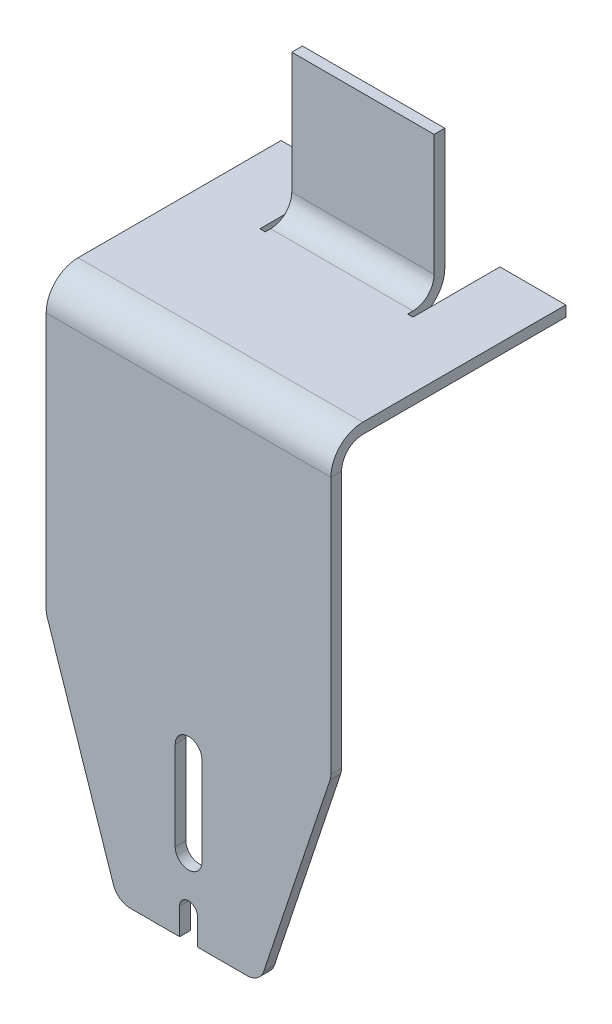
ISO-10303-21;
HEADER;
FILE_DESCRIPTION(('STEP AP214'),'2;1');
FILE_NAME('part.step','',(''),(''),'','','');
FILE_SCHEMA(('AUTOMOTIVE_DESIGN { 1 0 10303 214 1 1 1 1 }'));
ENDSEC;
DATA;
#1=APPLICATION_CONTEXT('core data for automotive mechanical design processes');
#2=APPLICATION_PROTOCOL_DEFINITION('international standard','automotive_design',2000,#1);
#3=PRODUCT_CONTEXT('',#1,'mechanical');
#4=PRODUCT('Part','Part','',(#3));
#5=PRODUCT_RELATED_PRODUCT_CATEGORY('part','',(#4));
#6=PRODUCT_DEFINITION_FORMATION('','',#4);
#7=PRODUCT_DEFINITION_CONTEXT('part definition',#1,'design');
#8=PRODUCT_DEFINITION('design','',#6,#7);
#9=PRODUCT_DEFINITION_SHAPE('','',#8);
#10=(LENGTH_UNIT() NAMED_UNIT(*) SI_UNIT(.MILLI.,.METRE.));
#11=(NAMED_UNIT(*) PLANE_ANGLE_UNIT() SI_UNIT($,.RADIAN.));
#12=(NAMED_UNIT(*) SI_UNIT($,.STERADIAN.) SOLID_ANGLE_UNIT());
#13=UNCERTAINTY_MEASURE_WITH_UNIT(LENGTH_MEASURE(1.E-05),#10,'distance_accuracy_value','');
#14=(GEOMETRIC_REPRESENTATION_CONTEXT(3) GLOBAL_UNCERTAINTY_ASSIGNED_CONTEXT((#13)) GLOBAL_UNIT_ASSIGNED_CONTEXT((#10,
#11,#12)) REPRESENTATION_CONTEXT('',''));
#15=CARTESIAN_POINT('',(0.,0.,0.));
#16=DIRECTION('',(0.,0.,1.));
#17=DIRECTION('',(1.,0.,0.));
#18=AXIS2_PLACEMENT_3D('',#15,#16,#17);
#19=CARTESIAN_POINT('',(0.,-2.89985202796982E-13,-83.09));
#20=DIRECTION('',(0.,0.,1.));
#21=DIRECTION('',(0.,-1.,0.));
#22=AXIS2_PLACEMENT_3D('',#19,#20,#21);
#23=PLANE('',#22);
#24=DIRECTION('',(0.,-1.,0.));
#25=VECTOR('',#24,1.);
#26=CARTESIAN_POINT('',(120.,11.9099999999998,-83.09));
#27=LINE('',#26,#25);
#28=CARTESIAN_POINT('',(120.,17.9099999999998,-83.09));
#29=VERTEX_POINT('',#28);
#30=CARTESIAN_POINT('',(120.,11.9099999999998,-83.09));
#31=VERTEX_POINT('',#30);
#32=EDGE_CURVE('E326',#29,#31,#27,.T.);
#33=ORIENTED_EDGE('',*,*,#32,.F.);
#34=DIRECTION('',(1.,0.,0.));
#35=VECTOR('',#34,1.);
#36=CARTESIAN_POINT('',(160.,17.9099999999998,-83.0900000000001));
#37=LINE('',#36,#35);
#38=CARTESIAN_POINT('',(123.,17.9099999999998,-83.09));
#39=VERTEX_POINT('',#38);
#40=EDGE_CURVE('E407',#29,#39,#37,.T.);
#41=ORIENTED_EDGE('',*,*,#40,.T.);
#42=DIRECTION('',(0.,1.,0.));
#43=VECTOR('',#42,1.);
#44=CARTESIAN_POINT('',(123.,11.9099999999998,-83.09));
#45=LINE('',#44,#43);
#46=CARTESIAN_POINT('',(123.,11.9099999999998,-83.09));
#47=VERTEX_POINT('',#46);
#48=EDGE_CURVE('E365',#47,#39,#45,.T.);
#49=ORIENTED_EDGE('',*,*,#48,.F.);
#50=DIRECTION('',(-1.,0.,0.));
#51=VECTOR('',#50,1.);
#52=CARTESIAN_POINT('',(160.,11.9099999999998,-83.09));
#53=LINE('',#52,#51);
#54=EDGE_CURVE('E72',#47,#31,#53,.T.);
#55=ORIENTED_EDGE('',*,*,#54,.T.);
#56=EDGE_LOOP('',(#33,#41,#49,#55));
#57=FACE_BOUND('',#56,.T.);
#58=ADVANCED_FACE('F46',(#57),#23,.F.);
#59=DIRECTION('',(0.,1.,0.));
#60=VECTOR('',#59,1.);
#61=CARTESIAN_POINT('',(40.,11.9099999999998,-83.09));
#62=LINE('',#61,#60);
#63=CARTESIAN_POINT('',(40.,11.9099999999998,-83.09));
#64=VERTEX_POINT('',#63);
#65=CARTESIAN_POINT('',(40.,17.9099999999998,-83.0900000000001));
#66=VERTEX_POINT('',#65);
#67=EDGE_CURVE('E64',#64,#66,#62,.T.);
#68=ORIENTED_EDGE('',*,*,#67,.F.);
#69=CARTESIAN_POINT('',(37.,11.9099999999998,-83.09));
#70=VERTEX_POINT('',#69);
#71=EDGE_CURVE('E404',#64,#70,#53,.T.);
#72=ORIENTED_EDGE('',*,*,#71,.T.);
#73=DIRECTION('',(0.,-1.,0.));
#74=VECTOR('',#73,1.);
#75=CARTESIAN_POINT('',(37.,11.9099999999998,-83.09));
#76=LINE('',#75,#74);
#77=CARTESIAN_POINT('',(37.,17.9099999999998,-83.09));
#78=VERTEX_POINT('',#77);
#79=EDGE_CURVE('E361',#78,#70,#76,.T.);
#80=ORIENTED_EDGE('',*,*,#79,.F.);
#81=EDGE_CURVE('E408',#78,#66,#37,.T.);
#82=ORIENTED_EDGE('',*,*,#81,.T.);
#83=EDGE_LOOP('',(#68,#72,#80,#82));
#84=FACE_BOUND('',#83,.T.);
#85=ADVANCED_FACE('F709',(#84),#23,.F.);
#86=CARTESIAN_POINT('',(0.,-144.47,-6.));
#87=DIRECTION('',(-1.,0.,0.));
#88=DIRECTION('',(0.,-1.,0.));
#89=AXIS2_PLACEMENT_3D('',#86,#87,#88);
#90=PLANE('',#89);
#91=DIRECTION('',(0.,-1.,0.));
#92=VECTOR('',#91,1.);
#93=CARTESIAN_POINT('',(0.,-144.47,0.));
#94=LINE('',#93,#92);
#95=CARTESIAN_POINT('',(0.,0.,0.));
#96=VERTEX_POINT('',#95);
#97=CARTESIAN_POINT('',(0.,-144.47,0.));
#98=VERTEX_POINT('',#97);
#99=EDGE_CURVE('E484',#96,#98,#94,.T.);
#100=ORIENTED_EDGE('',*,*,#99,.F.);
#101=DIRECTION('',(0.,0.,1.));
#102=VECTOR('',#101,1.);
#103=CARTESIAN_POINT('',(0.,0.,-6.));
#104=LINE('',#103,#102);
#105=CARTESIAN_POINT('',(0.,0.,-6.));
#106=VERTEX_POINT('',#105);
#107=EDGE_CURVE('E11',#106,#96,#104,.T.);
#108=ORIENTED_EDGE('',*,*,#107,.F.);
#109=DIRECTION('',(0.,-1.,0.));
#110=VECTOR('',#109,1.);
#111=CARTESIAN_POINT('',(0.,-144.47,-6.));
#112=LINE('',#111,#110);
#113=CARTESIAN_POINT('',(0.,-144.47,-6.));
#114=VERTEX_POINT('',#113);
#115=EDGE_CURVE('E494',#106,#114,#112,.T.);
#116=ORIENTED_EDGE('',*,*,#115,.T.);
#117=DIRECTION('',(0.,0.,1.));
#118=VECTOR('',#117,1.);
#119=CARTESIAN_POINT('',(0.,-144.47,-6.));
#120=LINE('',#119,#118);
#121=EDGE_CURVE('E50',#114,#98,#120,.T.);
#122=ORIENTED_EDGE('',*,*,#121,.T.);
#123=EDGE_LOOP('',(#100,#108,#116,#122));
#124=FACE_BOUND('',#123,.T.);
#125=ADVANCED_FACE('F48',(#124),#90,.T.);
#126=CARTESIAN_POINT('',(160.,0.,-6.));
#127=DIRECTION('',(1.,0.,0.));
#128=DIRECTION('',(0.,1.,0.));
#129=AXIS2_PLACEMENT_3D('',#126,#127,#128);
#130=PLANE('',#129);
#131=DIRECTION('',(0.,1.,0.));
#132=VECTOR('',#131,1.);
#133=CARTESIAN_POINT('',(160.,0.,0.));
#134=LINE('',#133,#132);
#135=CARTESIAN_POINT('',(160.,-144.47,0.));
#136=VERTEX_POINT('',#135);
#137=CARTESIAN_POINT('',(160.,0.,0.));
#138=VERTEX_POINT('',#137);
#139=EDGE_CURVE('E597',#136,#138,#134,.T.);
#140=ORIENTED_EDGE('',*,*,#139,.F.);
#141=DIRECTION('',(0.,0.,1.));
#142=VECTOR('',#141,1.);
#143=CARTESIAN_POINT('',(160.,-144.47,-6.));
#144=LINE('',#143,#142);
#145=CARTESIAN_POINT('',(160.,-144.47,-6.));
#146=VERTEX_POINT('',#145);
#147=EDGE_CURVE('E605',#146,#136,#144,.T.);
#148=ORIENTED_EDGE('',*,*,#147,.F.);
#149=DIRECTION('',(0.,1.,0.));
#150=VECTOR('',#149,1.);
#151=CARTESIAN_POINT('',(160.,0.,-6.));
#152=LINE('',#151,#150);
#153=CARTESIAN_POINT('',(160.,0.,-6.));
#154=VERTEX_POINT('',#153);
#155=EDGE_CURVE('E543',#146,#154,#152,.T.);
#156=ORIENTED_EDGE('',*,*,#155,.T.);
#157=DIRECTION('',(0.,0.,1.));
#158=VECTOR('',#157,1.);
#159=CARTESIAN_POINT('',(160.,0.,-6.));
#160=LINE('',#159,#158);
#161=EDGE_CURVE('E56',#154,#138,#160,.T.);
#162=ORIENTED_EDGE('',*,*,#161,.T.);
#163=EDGE_LOOP('',(#140,#148,#156,#162));
#164=FACE_BOUND('',#163,.T.);
#165=ADVANCED_FACE('F756',(#164),#130,.T.);
#166=CARTESIAN_POINT('',(150.,-144.47,-6.));
#167=DIRECTION('',(0.,0.,1.));
#168=DIRECTION('',(1.,0.,0.));
#169=AXIS2_PLACEMENT_3D('',#166,#167,#168);
#170=CYLINDRICAL_SURFACE('',#169,10.);
#171=CARTESIAN_POINT('',(150.,-144.47,0.));
#172=DIRECTION('',(0.,0.,1.));
#173=DIRECTION('',(1.,0.,0.));
#174=AXIS2_PLACEMENT_3D('',#171,#172,#173);
#175=CIRCLE('',#174,10.);
#176=CARTESIAN_POINT('',(159.486747985608,-147.632532633439,0.));
#177=VERTEX_POINT('',#176);
#178=EDGE_CURVE('E593',#177,#136,#175,.T.);
#179=ORIENTED_EDGE('',*,*,#178,.F.);
#180=DIRECTION('',(0.,0.,1.));
#181=VECTOR('',#180,1.);
#182=CARTESIAN_POINT('',(159.486747985608,-147.632532633439,-6.));
#183=LINE('',#182,#181);
#184=CARTESIAN_POINT('',(159.486747985608,-147.632532633439,-6.));
#185=VERTEX_POINT('',#184);
#186=EDGE_CURVE('E608',#185,#177,#183,.T.);
#187=ORIENTED_EDGE('',*,*,#186,.F.);
#188=CARTESIAN_POINT('',(150.,-144.47,-6.));
#189=DIRECTION('',(0.,0.,1.));
#190=DIRECTION('',(1.,0.,0.));
#191=AXIS2_PLACEMENT_3D('',#188,#189,#190);
#192=CIRCLE('',#191,10.);
#193=EDGE_CURVE('E539',#185,#146,#192,.T.);
#194=ORIENTED_EDGE('',*,*,#193,.T.);
#195=ORIENTED_EDGE('',*,*,#147,.T.);
#196=EDGE_LOOP('',(#179,#187,#194,#195));
#197=FACE_BOUND('',#196,.T.);
#198=ADVANCED_FACE('F759',(#197),#170,.T.);
#199=CARTESIAN_POINT('',(159.486747985608,-147.632532633439,-6.));
#200=DIRECTION('',(0.948674798560777,-0.316253263343904,0.));
#201=DIRECTION('',(0.316253263343904,0.948674798560777,0.));
#202=AXIS2_PLACEMENT_3D('',#199,#200,#201);
#203=PLANE('',#202);
#204=DIRECTION('',(0.316253263343904,0.948674798560777,0.));
#205=VECTOR('',#204,1.);
#206=CARTESIAN_POINT('',(159.486747985608,-147.632532633439,0.));
#207=LINE('',#206,#205);
#208=CARTESIAN_POINT('',(122.276747985608,-259.252532633439,0.));
#209=VERTEX_POINT('',#208);
#210=EDGE_CURVE('E589',#209,#177,#207,.T.);
#211=ORIENTED_EDGE('',*,*,#210,.F.);
#212=DIRECTION('',(0.,0.,1.));
#213=VECTOR('',#212,1.);
#214=CARTESIAN_POINT('',(122.276747985608,-259.252532633439,-6.));
#215=LINE('',#214,#213);
#216=CARTESIAN_POINT('',(122.276747985608,-259.252532633439,-6.));
#217=VERTEX_POINT('',#216);
#218=EDGE_CURVE('E611',#217,#209,#215,.T.);
#219=ORIENTED_EDGE('',*,*,#218,.F.);
#220=DIRECTION('',(0.316253263343904,0.948674798560777,0.));
#221=VECTOR('',#220,1.);
#222=CARTESIAN_POINT('',(159.486747985608,-147.632532633439,-6.));
#223=LINE('',#222,#221);
#224=EDGE_CURVE('E535',#217,#185,#223,.T.);
#225=ORIENTED_EDGE('',*,*,#224,.T.);
#226=ORIENTED_EDGE('',*,*,#186,.T.);
#227=EDGE_LOOP('',(#211,#219,#225,#226));
#228=FACE_BOUND('',#227,.T.);
#229=ADVANCED_FACE('F763',(#228),#203,.T.);
#230=CARTESIAN_POINT('',(112.79,-256.09,-6.));
#231=DIRECTION('',(0.,0.,1.));
#232=DIRECTION('',(1.,0.,0.));
#233=AXIS2_PLACEMENT_3D('',#230,#231,#232);
#234=CYLINDRICAL_SURFACE('',#233,9.99999999999998);
#235=CARTESIAN_POINT('',(112.79,-256.09,0.));
#236=DIRECTION('',(0.,0.,1.));
#237=DIRECTION('',(-1.,0.,0.));
#238=AXIS2_PLACEMENT_3D('',#235,#236,#237);
#239=CIRCLE('',#238,9.99999999999998);
#240=CARTESIAN_POINT('',(112.79,-266.09,0.));
#241=VERTEX_POINT('',#240);
#242=EDGE_CURVE('E585',#241,#209,#239,.T.);
#243=ORIENTED_EDGE('',*,*,#242,.F.);
#244=DIRECTION('',(0.,0.,1.));
#245=VECTOR('',#244,1.);
#246=CARTESIAN_POINT('',(112.79,-266.09,-6.));
#247=LINE('',#246,#245);
#248=CARTESIAN_POINT('',(112.79,-266.09,-6.));
#249=VERTEX_POINT('',#248);
#250=EDGE_CURVE('E614',#249,#241,#247,.T.);
#251=ORIENTED_EDGE('',*,*,#250,.F.);
#252=CARTESIAN_POINT('',(112.79,-256.09,-6.));
#253=DIRECTION('',(0.,0.,1.));
#254=DIRECTION('',(-1.,0.,0.));
#255=AXIS2_PLACEMENT_3D('',#252,#253,#254);
#256=CIRCLE('',#255,9.99999999999998);
#257=EDGE_CURVE('E531',#249,#217,#256,.T.);
#258=ORIENTED_EDGE('',*,*,#257,.T.);
#259=ORIENTED_EDGE('',*,*,#218,.T.);
#260=EDGE_LOOP('',(#243,#251,#258,#259));
#261=FACE_BOUND('',#260,.T.);
#262=ADVANCED_FACE('F767',(#261),#234,.T.);
#263=CARTESIAN_POINT('',(112.79,-266.09,-6.));
#264=DIRECTION('',(0.,-1.,0.));
#265=DIRECTION('',(0.,0.,-1.));
#266=AXIS2_PLACEMENT_3D('',#263,#264,#265);
#267=PLANE('',#266);
#268=DIRECTION('',(1.,0.,0.));
#269=VECTOR('',#268,1.);
#270=CARTESIAN_POINT('',(112.79,-266.09,0.));
#271=LINE('',#270,#269);
#272=CARTESIAN_POINT('',(85.,-266.09,0.));
#273=VERTEX_POINT('',#272);
#274=EDGE_CURVE('E581',#273,#241,#271,.T.);
#275=ORIENTED_EDGE('',*,*,#274,.F.);
#276=DIRECTION('',(0.,0.,1.));
#277=VECTOR('',#276,1.);
#278=CARTESIAN_POINT('',(85.,-266.09,-6.));
#279=LINE('',#278,#277);
#280=CARTESIAN_POINT('',(85.,-266.09,-6.));
#281=VERTEX_POINT('',#280);
#282=EDGE_CURVE('E617',#281,#273,#279,.T.);
#283=ORIENTED_EDGE('',*,*,#282,.F.);
#284=DIRECTION('',(1.,0.,0.));
#285=VECTOR('',#284,1.);
#286=CARTESIAN_POINT('',(112.79,-266.09,-6.));
#287=LINE('',#286,#285);
#288=EDGE_CURVE('E527',#281,#249,#287,.T.);
#289=ORIENTED_EDGE('',*,*,#288,.T.);
#290=ORIENTED_EDGE('',*,*,#250,.T.);
#291=EDGE_LOOP('',(#275,#283,#289,#290));
#292=FACE_BOUND('',#291,.T.);
#293=ADVANCED_FACE('F771',(#292),#267,.T.);
#294=CARTESIAN_POINT('',(85.,-266.09,-6.));
#295=DIRECTION('',(-1.,0.,0.));
#296=DIRECTION('',(0.,-1.,0.));
#297=AXIS2_PLACEMENT_3D('',#294,#295,#296);
#298=PLANE('',#297);
#299=DIRECTION('',(0.,-1.,0.));
#300=VECTOR('',#299,1.);
#301=CARTESIAN_POINT('',(85.,-266.09,0.));
#302=LINE('',#301,#300);
#303=CARTESIAN_POINT('',(85.,-251.09,0.));
#304=VERTEX_POINT('',#303);
#305=EDGE_CURVE('E577',#304,#273,#302,.T.);
#306=ORIENTED_EDGE('',*,*,#305,.F.);
#307=DIRECTION('',(0.,0.,1.));
#308=VECTOR('',#307,1.);
#309=CARTESIAN_POINT('',(85.,-251.09,-6.));
#310=LINE('',#309,#308);
#311=CARTESIAN_POINT('',(85.,-251.09,-6.));
#312=VERTEX_POINT('',#311);
#313=EDGE_CURVE('E620',#312,#304,#310,.T.);
#314=ORIENTED_EDGE('',*,*,#313,.F.);
#315=DIRECTION('',(0.,-1.,0.));
#316=VECTOR('',#315,1.);
#317=CARTESIAN_POINT('',(85.,-266.09,-6.));
#318=LINE('',#317,#316);
#319=EDGE_CURVE('E523',#312,#281,#318,.T.);
#320=ORIENTED_EDGE('',*,*,#319,.T.);
#321=ORIENTED_EDGE('',*,*,#282,.T.);
#322=EDGE_LOOP('',(#306,#314,#320,#321));
#323=FACE_BOUND('',#322,.T.);
#324=ADVANCED_FACE('F775',(#323),#298,.T.);
#325=CARTESIAN_POINT('',(80.,-251.09,-6.));
#326=DIRECTION('',(0.,0.,1.));
#327=DIRECTION('',(1.,0.,0.));
#328=AXIS2_PLACEMENT_3D('',#325,#326,#327);
#329=CYLINDRICAL_SURFACE('',#328,4.99999999999999);
#330=CARTESIAN_POINT('',(80.,-251.09,0.));
#331=DIRECTION('',(0.,0.,-1.));
#332=DIRECTION('',(1.,0.,0.));
#333=AXIS2_PLACEMENT_3D('',#330,#331,#332);
#334=CIRCLE('',#333,4.99999999999999);
#335=CARTESIAN_POINT('',(75.,-251.09,0.));
#336=VERTEX_POINT('',#335);
#337=EDGE_CURVE('E573',#336,#304,#334,.T.);
#338=ORIENTED_EDGE('',*,*,#337,.F.);
#339=DIRECTION('',(0.,0.,1.));
#340=VECTOR('',#339,1.);
#341=CARTESIAN_POINT('',(75.,-251.09,-6.));
#342=LINE('',#341,#340);
#343=CARTESIAN_POINT('',(75.,-251.09,-6.));
#344=VERTEX_POINT('',#343);
#345=EDGE_CURVE('E623',#344,#336,#342,.T.);
#346=ORIENTED_EDGE('',*,*,#345,.F.);
#347=CARTESIAN_POINT('',(80.,-251.09,-6.));
#348=DIRECTION('',(0.,0.,-1.));
#349=DIRECTION('',(1.,0.,0.));
#350=AXIS2_PLACEMENT_3D('',#347,#348,#349);
#351=CIRCLE('',#350,4.99999999999999);
#352=EDGE_CURVE('E519',#344,#312,#351,.T.);
#353=ORIENTED_EDGE('',*,*,#352,.T.);
#354=ORIENTED_EDGE('',*,*,#313,.T.);
#355=EDGE_LOOP('',(#338,#346,#353,#354));
#356=FACE_BOUND('',#355,.T.);
#357=ADVANCED_FACE('F779',(#356),#329,.F.);
#358=CARTESIAN_POINT('',(75.,-251.09,-6.));
#359=DIRECTION('',(1.,0.,0.));
#360=DIRECTION('',(0.,0.,-1.));
#361=AXIS2_PLACEMENT_3D('',#358,#359,#360);
#362=PLANE('',#361);
#363=DIRECTION('',(0.,1.,0.));
#364=VECTOR('',#363,1.);
#365=CARTESIAN_POINT('',(75.,-251.09,0.));
#366=LINE('',#365,#364);
#367=CARTESIAN_POINT('',(75.,-266.09,0.));
#368=VERTEX_POINT('',#367);
#369=EDGE_CURVE('E569',#368,#336,#366,.T.);
#370=ORIENTED_EDGE('',*,*,#369,.F.);
#371=DIRECTION('',(0.,0.,1.));
#372=VECTOR('',#371,1.);
#373=CARTESIAN_POINT('',(75.,-266.09,-6.));
#374=LINE('',#373,#372);
#375=CARTESIAN_POINT('',(75.,-266.09,-6.));
#376=VERTEX_POINT('',#375);
#377=EDGE_CURVE('E626',#376,#368,#374,.T.);
#378=ORIENTED_EDGE('',*,*,#377,.F.);
#379=DIRECTION('',(0.,1.,0.));
#380=VECTOR('',#379,1.);
#381=CARTESIAN_POINT('',(75.,-251.09,-6.));
#382=LINE('',#381,#380);
#383=EDGE_CURVE('E515',#376,#344,#382,.T.);
#384=ORIENTED_EDGE('',*,*,#383,.T.);
#385=ORIENTED_EDGE('',*,*,#345,.T.);
#386=EDGE_LOOP('',(#370,#378,#384,#385));
#387=FACE_BOUND('',#386,.T.);
#388=ADVANCED_FACE('F783',(#387),#362,.T.);
#389=CARTESIAN_POINT('',(75.,-266.09,-6.));
#390=DIRECTION('',(0.,-1.,0.));
#391=DIRECTION('',(0.,0.,-1.));
#392=AXIS2_PLACEMENT_3D('',#389,#390,#391);
#393=PLANE('',#392);
#394=DIRECTION('',(1.,0.,0.));
#395=VECTOR('',#394,1.);
#396=CARTESIAN_POINT('',(75.,-266.09,0.));
#397=LINE('',#396,#395);
#398=CARTESIAN_POINT('',(47.21,-266.09,0.));
#399=VERTEX_POINT('',#398);
#400=EDGE_CURVE('E565',#399,#368,#397,.T.);
#401=ORIENTED_EDGE('',*,*,#400,.F.);
#402=DIRECTION('',(0.,0.,1.));
#403=VECTOR('',#402,1.);
#404=CARTESIAN_POINT('',(47.21,-266.09,-6.));
#405=LINE('',#404,#403);
#406=CARTESIAN_POINT('',(47.21,-266.09,-6.));
#407=VERTEX_POINT('',#406);
#408=EDGE_CURVE('E629',#407,#399,#405,.T.);
#409=ORIENTED_EDGE('',*,*,#408,.F.);
#410=DIRECTION('',(1.,0.,0.));
#411=VECTOR('',#410,1.);
#412=CARTESIAN_POINT('',(75.,-266.09,-6.));
#413=LINE('',#412,#411);
#414=EDGE_CURVE('E511',#407,#376,#413,.T.);
#415=ORIENTED_EDGE('',*,*,#414,.T.);
#416=ORIENTED_EDGE('',*,*,#377,.T.);
#417=EDGE_LOOP('',(#401,#409,#415,#416));
#418=FACE_BOUND('',#417,.T.);
#419=ADVANCED_FACE('F787',(#418),#393,.T.);
#420=CARTESIAN_POINT('',(47.21,-256.09,-6.));
#421=DIRECTION('',(0.,0.,1.));
#422=DIRECTION('',(1.,0.,0.));
#423=AXIS2_PLACEMENT_3D('',#420,#421,#422);
#424=CYLINDRICAL_SURFACE('',#423,10.);
#425=CARTESIAN_POINT('',(47.21,-256.09,0.));
#426=DIRECTION('',(0.,0.,1.));
#427=DIRECTION('',(-1.,0.,0.));
#428=AXIS2_PLACEMENT_3D('',#425,#426,#427);
#429=CIRCLE('',#428,10.);
#430=CARTESIAN_POINT('',(37.7232520143922,-259.252532633439,0.));
#431=VERTEX_POINT('',#430);
#432=EDGE_CURVE('E561',#431,#399,#429,.T.);
#433=ORIENTED_EDGE('',*,*,#432,.F.);
#434=DIRECTION('',(0.,0.,1.));
#435=VECTOR('',#434,1.);
#436=CARTESIAN_POINT('',(37.7232520143922,-259.252532633439,-6.));
#437=LINE('',#436,#435);
#438=CARTESIAN_POINT('',(37.7232520143922,-259.252532633439,-6.));
#439=VERTEX_POINT('',#438);
#440=EDGE_CURVE('E632',#439,#431,#437,.T.);
#441=ORIENTED_EDGE('',*,*,#440,.F.);
#442=CARTESIAN_POINT('',(47.21,-256.09,-6.));
#443=DIRECTION('',(0.,0.,1.));
#444=DIRECTION('',(-1.,0.,0.));
#445=AXIS2_PLACEMENT_3D('',#442,#443,#444);
#446=CIRCLE('',#445,10.);
#447=EDGE_CURVE('E507',#439,#407,#446,.T.);
#448=ORIENTED_EDGE('',*,*,#447,.T.);
#449=ORIENTED_EDGE('',*,*,#408,.T.);
#450=EDGE_LOOP('',(#433,#441,#448,#449));
#451=FACE_BOUND('',#450,.T.);
#452=ADVANCED_FACE('F791',(#451),#424,.T.);
#453=CARTESIAN_POINT('',(37.7232520143923,-259.252532633439,-6.));
#454=DIRECTION('',(-0.948674798560777,-0.316253263343904,0.));
#455=DIRECTION('',(0.316253263343904,-0.948674798560777,0.));
#456=AXIS2_PLACEMENT_3D('',#453,#454,#455);
#457=PLANE('',#456);
#458=DIRECTION('',(0.316253263343904,-0.948674798560777,0.));
#459=VECTOR('',#458,1.);
#460=CARTESIAN_POINT('',(37.7232520143923,-259.252532633439,0.));
#461=LINE('',#460,#459);
#462=CARTESIAN_POINT('',(0.513252014392235,-147.632532633439,0.));
#463=VERTEX_POINT('',#462);
#464=EDGE_CURVE('E557',#463,#431,#461,.T.);
#465=ORIENTED_EDGE('',*,*,#464,.F.);
#466=DIRECTION('',(0.,0.,1.));
#467=VECTOR('',#466,1.);
#468=CARTESIAN_POINT('',(0.513252014392235,-147.632532633439,-6.));
#469=LINE('',#468,#467);
#470=CARTESIAN_POINT('',(0.513252014392235,-147.632532633439,-6.));
#471=VERTEX_POINT('',#470);
#472=EDGE_CURVE('E634',#471,#463,#469,.T.);
#473=ORIENTED_EDGE('',*,*,#472,.F.);
#474=DIRECTION('',(0.316253263343904,-0.948674798560777,0.));
#475=VECTOR('',#474,1.);
#476=CARTESIAN_POINT('',(37.7232520143923,-259.252532633439,-6.));
#477=LINE('',#476,#475);
#478=EDGE_CURVE('E503',#471,#439,#477,.T.);
#479=ORIENTED_EDGE('',*,*,#478,.T.);
#480=ORIENTED_EDGE('',*,*,#440,.T.);
#481=EDGE_LOOP('',(#465,#473,#479,#480));
#482=FACE_BOUND('',#481,.T.);
#483=ADVANCED_FACE('F795',(#482),#457,.T.);
#484=CARTESIAN_POINT('',(10.,-144.47,-6.));
#485=DIRECTION('',(0.,0.,1.));
#486=DIRECTION('',(1.,0.,0.));
#487=AXIS2_PLACEMENT_3D('',#484,#485,#486);
#488=CYLINDRICAL_SURFACE('',#487,10.);
#489=CARTESIAN_POINT('',(10.,-144.47,0.));
#490=DIRECTION('',(0.,0.,1.));
#491=DIRECTION('',(1.,0.,0.));
#492=AXIS2_PLACEMENT_3D('',#489,#490,#491);
#493=CIRCLE('',#492,10.);
#494=EDGE_CURVE('E553',#98,#463,#493,.T.);
#495=ORIENTED_EDGE('',*,*,#494,.F.);
#496=ORIENTED_EDGE('',*,*,#121,.F.);
#497=CARTESIAN_POINT('',(10.,-144.47,-6.));
#498=DIRECTION('',(0.,0.,1.));
#499=DIRECTION('',(1.,0.,0.));
#500=AXIS2_PLACEMENT_3D('',#497,#498,#499);
#501=CIRCLE('',#500,10.);
#502=EDGE_CURVE('E498',#114,#471,#501,.T.);
#503=ORIENTED_EDGE('',*,*,#502,.T.);
#504=ORIENTED_EDGE('',*,*,#472,.T.);
#505=EDGE_LOOP('',(#495,#496,#503,#504));
#506=FACE_BOUND('',#505,.T.);
#507=ADVANCED_FACE('F644',(#506),#488,.T.);
#508=CARTESIAN_POINT('',(150.,-144.47,-6.));
#509=DIRECTION('',(0.,0.,1.));
#510=DIRECTION('',(1.,0.,0.));
#511=AXIS2_PLACEMENT_3D('',#508,#509,#510);
#512=PLANE('',#511);
#513=DIRECTION('',(0.,1.,0.));
#514=VECTOR('',#513,1.);
#515=CARTESIAN_POINT('',(87.5,-173.59,-6.));
#516=LINE('',#515,#514);
#517=CARTESIAN_POINT('',(87.5,-223.59,-6.));
#518=VERTEX_POINT('',#517);
#519=CARTESIAN_POINT('',(87.5,-173.59,-6.));
#520=VERTEX_POINT('',#519);
#521=EDGE_CURVE('E463',#518,#520,#516,.T.);
#522=ORIENTED_EDGE('',*,*,#521,.T.);
#523=CARTESIAN_POINT('',(80.,-173.59,-6.));
#524=DIRECTION('',(0.,0.,1.));
#525=DIRECTION('',(1.,0.,0.));
#526=AXIS2_PLACEMENT_3D('',#523,#524,#525);
#527=CIRCLE('',#526,7.50000000000001);
#528=CARTESIAN_POINT('',(72.5,-173.59,-6.));
#529=VERTEX_POINT('',#528);
#530=EDGE_CURVE('E450',#520,#529,#527,.T.);
#531=ORIENTED_EDGE('',*,*,#530,.T.);
#532=DIRECTION('',(0.,-1.,0.));
#533=VECTOR('',#532,1.);
#534=CARTESIAN_POINT('',(72.5,-173.59,-6.));
#535=LINE('',#534,#533);
#536=CARTESIAN_POINT('',(72.5,-223.59,-6.));
#537=VERTEX_POINT('',#536);
#538=EDGE_CURVE('E454',#529,#537,#535,.T.);
#539=ORIENTED_EDGE('',*,*,#538,.T.);
#540=CARTESIAN_POINT('',(80.,-223.59,-6.));
#541=DIRECTION('',(0.,0.,1.));
#542=DIRECTION('',(1.,0.,0.));
#543=AXIS2_PLACEMENT_3D('',#540,#541,#542);
#544=CIRCLE('',#543,7.5);
#545=EDGE_CURVE('E459',#537,#518,#544,.T.);
#546=ORIENTED_EDGE('',*,*,#545,.T.);
#547=EDGE_LOOP('',(#522,#531,#539,#546));
#548=FACE_BOUND('',#547,.T.);
#549=ORIENTED_EDGE('',*,*,#115,.F.);
#550=DIRECTION('',(-1.,0.,0.));
#551=VECTOR('',#550,1.);
#552=CARTESIAN_POINT('',(0.,0.,-6.));
#553=LINE('',#552,#551);
#554=EDGE_CURVE('E546',#154,#106,#553,.T.);
#555=ORIENTED_EDGE('',*,*,#554,.F.);
#556=ORIENTED_EDGE('',*,*,#155,.F.);
#557=ORIENTED_EDGE('',*,*,#193,.F.);
#558=ORIENTED_EDGE('',*,*,#224,.F.);
#559=ORIENTED_EDGE('',*,*,#257,.F.);
#560=ORIENTED_EDGE('',*,*,#288,.F.);
#561=ORIENTED_EDGE('',*,*,#319,.F.);
#562=ORIENTED_EDGE('',*,*,#352,.F.);
#563=ORIENTED_EDGE('',*,*,#383,.F.);
#564=ORIENTED_EDGE('',*,*,#414,.F.);
#565=ORIENTED_EDGE('',*,*,#447,.F.);
#566=ORIENTED_EDGE('',*,*,#478,.F.);
#567=ORIENTED_EDGE('',*,*,#502,.F.);
#568=EDGE_LOOP('',(#549,#555,#556,#557,#558,#559,#560,#561,#562,#563,#564,#565,#566,#567));
#569=FACE_BOUND('',#568,.T.);
#570=ADVANCED_FACE('F749',(#548,#569),#512,.F.);
#571=CARTESIAN_POINT('',(150.,-144.47,0.));
#572=DIRECTION('',(0.,0.,1.));
#573=DIRECTION('',(1.,0.,0.));
#574=AXIS2_PLACEMENT_3D('',#571,#572,#573);
#575=PLANE('',#574);
#576=CARTESIAN_POINT('',(80.,-173.59,0.));
#577=DIRECTION('',(0.,0.,1.));
#578=DIRECTION('',(1.,0.,0.));
#579=AXIS2_PLACEMENT_3D('',#576,#577,#578);
#580=CIRCLE('',#579,7.50000000000001);
#581=CARTESIAN_POINT('',(87.5,-173.59,0.));
#582=VERTEX_POINT('',#581);
#583=CARTESIAN_POINT('',(72.5,-173.59,0.));
#584=VERTEX_POINT('',#583);
#585=EDGE_CURVE('E432',#582,#584,#580,.T.);
#586=ORIENTED_EDGE('',*,*,#585,.F.);
#587=DIRECTION('',(0.,1.,0.));
#588=VECTOR('',#587,1.);
#589=CARTESIAN_POINT('',(87.5,-173.59,0.));
#590=LINE('',#589,#588);
#591=CARTESIAN_POINT('',(87.5,-223.59,0.));
#592=VERTEX_POINT('',#591);
#593=EDGE_CURVE('E455',#592,#582,#590,.T.);
#594=ORIENTED_EDGE('',*,*,#593,.F.);
#595=CARTESIAN_POINT('',(80.,-223.59,0.));
#596=DIRECTION('',(0.,0.,1.));
#597=DIRECTION('',(1.,0.,0.));
#598=AXIS2_PLACEMENT_3D('',#595,#596,#597);
#599=CIRCLE('',#598,7.5);
#600=CARTESIAN_POINT('',(72.5,-223.59,0.));
#601=VERTEX_POINT('',#600);
#602=EDGE_CURVE('E474',#601,#592,#599,.T.);
#603=ORIENTED_EDGE('',*,*,#602,.F.);
#604=DIRECTION('',(0.,-1.,0.));
#605=VECTOR('',#604,1.);
#606=CARTESIAN_POINT('',(72.5,-173.59,0.));
#607=LINE('',#606,#605);
#608=EDGE_CURVE('E470',#584,#601,#607,.T.);
#609=ORIENTED_EDGE('',*,*,#608,.F.);
#610=EDGE_LOOP('',(#586,#594,#603,#609));
#611=FACE_BOUND('',#610,.T.);
#612=ORIENTED_EDGE('',*,*,#99,.T.);
#613=ORIENTED_EDGE('',*,*,#494,.T.);
#614=ORIENTED_EDGE('',*,*,#464,.T.);
#615=ORIENTED_EDGE('',*,*,#432,.T.);
#616=ORIENTED_EDGE('',*,*,#400,.T.);
#617=ORIENTED_EDGE('',*,*,#369,.T.);
#618=ORIENTED_EDGE('',*,*,#337,.T.);
#619=ORIENTED_EDGE('',*,*,#305,.T.);
#620=ORIENTED_EDGE('',*,*,#274,.T.);
#621=ORIENTED_EDGE('',*,*,#242,.T.);
#622=ORIENTED_EDGE('',*,*,#210,.T.);
#623=ORIENTED_EDGE('',*,*,#178,.T.);
#624=ORIENTED_EDGE('',*,*,#139,.T.);
#625=DIRECTION('',(-1.,0.,0.));
#626=VECTOR('',#625,1.);
#627=CARTESIAN_POINT('',(0.,0.,0.));
#628=LINE('',#627,#626);
#629=EDGE_CURVE('E499',#138,#96,#628,.T.);
#630=ORIENTED_EDGE('',*,*,#629,.T.);
#631=EDGE_LOOP('',(#612,#613,#614,#615,#616,#617,#618,#619,#620,#621,#622,#623,#624,#630));
#632=FACE_BOUND('',#631,.T.);
#633=ADVANCED_FACE('F646',(#611,#632),#575,.T.);
#634=CARTESIAN_POINT('',(80.,-173.59,-6.));
#635=DIRECTION('',(0.,0.,1.));
#636=DIRECTION('',(1.,0.,0.));
#637=AXIS2_PLACEMENT_3D('',#634,#635,#636);
#638=CYLINDRICAL_SURFACE('',#637,7.50000000000001);
#639=ORIENTED_EDGE('',*,*,#585,.T.);
#640=DIRECTION('',(0.,0.,1.));
#641=VECTOR('',#640,1.);
#642=CARTESIAN_POINT('',(72.5,-173.59,-6.));
#643=LINE('',#642,#641);
#644=EDGE_CURVE('E467',#529,#584,#643,.T.);
#645=ORIENTED_EDGE('',*,*,#644,.F.);
#646=ORIENTED_EDGE('',*,*,#530,.F.);
#647=DIRECTION('',(0.,0.,1.));
#648=VECTOR('',#647,1.);
#649=CARTESIAN_POINT('',(87.5,-173.59,-6.));
#650=LINE('',#649,#648);
#651=EDGE_CURVE('E481',#520,#582,#650,.T.);
#652=ORIENTED_EDGE('',*,*,#651,.T.);
#653=EDGE_LOOP('',(#639,#645,#646,#652));
#654=FACE_BOUND('',#653,.T.);
#655=ADVANCED_FACE('F738',(#654),#638,.F.);
#656=CARTESIAN_POINT('',(87.5,-173.59,-6.));
#657=DIRECTION('',(1.,0.,0.));
#658=DIRECTION('',(0.,0.,-1.));
#659=AXIS2_PLACEMENT_3D('',#656,#657,#658);
#660=PLANE('',#659);
#661=ORIENTED_EDGE('',*,*,#593,.T.);
#662=ORIENTED_EDGE('',*,*,#651,.F.);
#663=ORIENTED_EDGE('',*,*,#521,.F.);
#664=DIRECTION('',(0.,0.,1.));
#665=VECTOR('',#664,1.);
#666=CARTESIAN_POINT('',(87.5,-223.59,-6.));
#667=LINE('',#666,#665);
#668=EDGE_CURVE('E485',#518,#592,#667,.T.);
#669=ORIENTED_EDGE('',*,*,#668,.T.);
#670=EDGE_LOOP('',(#661,#662,#663,#669));
#671=FACE_BOUND('',#670,.T.);
#672=ADVANCED_FACE('F734',(#671),#660,.F.);
#673=CARTESIAN_POINT('',(80.,-223.59,-6.));
#674=DIRECTION('',(0.,0.,1.));
#675=DIRECTION('',(1.,0.,0.));
#676=AXIS2_PLACEMENT_3D('',#673,#674,#675);
#677=CYLINDRICAL_SURFACE('',#676,7.5);
#678=ORIENTED_EDGE('',*,*,#602,.T.);
#679=ORIENTED_EDGE('',*,*,#668,.F.);
#680=ORIENTED_EDGE('',*,*,#545,.F.);
#681=DIRECTION('',(0.,0.,1.));
#682=VECTOR('',#681,1.);
#683=CARTESIAN_POINT('',(72.5,-223.59,-6.));
#684=LINE('',#683,#682);
#685=EDGE_CURVE('E488',#537,#601,#684,.T.);
#686=ORIENTED_EDGE('',*,*,#685,.T.);
#687=EDGE_LOOP('',(#678,#679,#680,#686));
#688=FACE_BOUND('',#687,.T.);
#689=ADVANCED_FACE('F737',(#688),#677,.F.);
#690=CARTESIAN_POINT('',(72.5,-173.59,-6.));
#691=DIRECTION('',(-1.,0.,0.));
#692=DIRECTION('',(0.,-1.,0.));
#693=AXIS2_PLACEMENT_3D('',#690,#691,#692);
#694=PLANE('',#693);
#695=ORIENTED_EDGE('',*,*,#608,.T.);
#696=ORIENTED_EDGE('',*,*,#685,.F.);
#697=ORIENTED_EDGE('',*,*,#538,.F.);
#698=ORIENTED_EDGE('',*,*,#644,.T.);
#699=EDGE_LOOP('',(#695,#696,#697,#698));
#700=FACE_BOUND('',#699,.T.);
#701=ADVANCED_FACE('F730',(#700),#694,.F.);
#702=CARTESIAN_POINT('',(0.,0.,-17.91));
#703=DIRECTION('',(-1.,0.,0.));
#704=DIRECTION('',(0.,-1.,0.));
#705=AXIS2_PLACEMENT_3D('',#702,#703,#704);
#706=PLANE('',#705);
#707=CARTESIAN_POINT('',(0.,0.,-17.91));
#708=DIRECTION('',(1.,0.,0.));
#709=DIRECTION('',(0.,1.,0.));
#710=AXIS2_PLACEMENT_3D('',#707,#708,#709);
#711=CIRCLE('',#710,17.91);
#712=CARTESIAN_POINT('',(0.,17.91,-17.9100000000001));
#713=VERTEX_POINT('',#712);
#714=EDGE_CURVE('E428',#96,#713,#711,.F.);
#715=ORIENTED_EDGE('',*,*,#714,.T.);
#716=DIRECTION('',(0.,0.,1.));
#717=VECTOR('',#716,1.);
#718=CARTESIAN_POINT('',(0.,17.9099999999998,-83.0900000000001));
#719=LINE('',#718,#717);
#720=CARTESIAN_POINT('',(0.,17.9099999999996,-132.));
#721=VERTEX_POINT('',#720);
#722=EDGE_CURVE('E415',#721,#713,#719,.T.);
#723=ORIENTED_EDGE('',*,*,#722,.F.);
#724=DIRECTION('',(0.,1.,0.));
#725=VECTOR('',#724,1.);
#726=CARTESIAN_POINT('',(0.,11.9099999999996,-132.));
#727=LINE('',#726,#725);
#728=CARTESIAN_POINT('',(0.,11.9099999999996,-132.));
#729=VERTEX_POINT('',#728);
#730=EDGE_CURVE('E372',#729,#721,#727,.T.);
#731=ORIENTED_EDGE('',*,*,#730,.F.);
#732=DIRECTION('',(0.,0.,1.));
#733=VECTOR('',#732,1.);
#734=CARTESIAN_POINT('',(0.,11.9099999999998,-83.09));
#735=LINE('',#734,#733);
#736=CARTESIAN_POINT('',(0.,11.91,-17.91));
#737=VERTEX_POINT('',#736);
#738=EDGE_CURVE('E419',#729,#737,#735,.T.);
#739=ORIENTED_EDGE('',*,*,#738,.T.);
#740=CARTESIAN_POINT('',(0.,0.,-17.91));
#741=DIRECTION('',(1.,0.,0.));
#742=DIRECTION('',(0.,1.,0.));
#743=AXIS2_PLACEMENT_3D('',#740,#741,#742);
#744=CIRCLE('',#743,11.91);
#745=EDGE_CURVE('E438',#106,#737,#744,.F.);
#746=ORIENTED_EDGE('',*,*,#745,.F.);
#747=ORIENTED_EDGE('',*,*,#107,.T.);
#748=EDGE_LOOP('',(#715,#723,#731,#739,#746,#747));
#749=FACE_BOUND('',#748,.T.);
#750=ADVANCED_FACE('F727',(#749),#706,.T.);
#751=CARTESIAN_POINT('',(160.,0.,-17.91));
#752=DIRECTION('',(-1.,0.,0.));
#753=DIRECTION('',(0.,-1.,0.));
#754=AXIS2_PLACEMENT_3D('',#751,#752,#753);
#755=PLANE('',#754);
#756=CARTESIAN_POINT('',(160.,0.,-17.91));
#757=DIRECTION('',(1.,0.,0.));
#758=DIRECTION('',(0.,1.,0.));
#759=AXIS2_PLACEMENT_3D('',#756,#757,#758);
#760=CIRCLE('',#759,11.91);
#761=CARTESIAN_POINT('',(160.,11.91,-17.91));
#762=VERTEX_POINT('',#761);
#763=EDGE_CURVE('E444',#762,#154,#760,.T.);
#764=ORIENTED_EDGE('',*,*,#763,.F.);
#765=DIRECTION('',(0.,0.,1.));
#766=VECTOR('',#765,1.);
#767=CARTESIAN_POINT('',(160.,11.9099999999998,-83.09));
#768=LINE('',#767,#766);
#769=CARTESIAN_POINT('',(160.,11.9099999999996,-132.));
#770=VERTEX_POINT('',#769);
#771=EDGE_CURVE('E423',#770,#762,#768,.T.);
#772=ORIENTED_EDGE('',*,*,#771,.F.);
#773=DIRECTION('',(0.,-1.,0.));
#774=VECTOR('',#773,1.);
#775=CARTESIAN_POINT('',(160.,11.9099999999996,-132.));
#776=LINE('',#775,#774);
#777=CARTESIAN_POINT('',(160.,17.9099999999996,-132.));
#778=VERTEX_POINT('',#777);
#779=EDGE_CURVE('E379',#778,#770,#776,.T.);
#780=ORIENTED_EDGE('',*,*,#779,.F.);
#781=DIRECTION('',(0.,0.,1.));
#782=VECTOR('',#781,1.);
#783=CARTESIAN_POINT('',(160.,17.9099999999998,-83.0900000000001));
#784=LINE('',#783,#782);
#785=CARTESIAN_POINT('',(160.,17.91,-17.9100000000001));
#786=VERTEX_POINT('',#785);
#787=EDGE_CURVE('E411',#778,#786,#784,.T.);
#788=ORIENTED_EDGE('',*,*,#787,.T.);
#789=CARTESIAN_POINT('',(160.,0.,-17.91));
#790=DIRECTION('',(1.,0.,0.));
#791=DIRECTION('',(0.,1.,0.));
#792=AXIS2_PLACEMENT_3D('',#789,#790,#791);
#793=CIRCLE('',#792,17.91);
#794=EDGE_CURVE('E433',#786,#138,#793,.T.);
#795=ORIENTED_EDGE('',*,*,#794,.T.);
#796=ORIENTED_EDGE('',*,*,#161,.F.);
#797=EDGE_LOOP('',(#764,#772,#780,#788,#795,#796));
#798=FACE_BOUND('',#797,.T.);
#799=ADVANCED_FACE('F655',(#798),#755,.F.);
#800=CARTESIAN_POINT('',(160.,0.,-17.91));
#801=DIRECTION('',(1.,0.,0.));
#802=DIRECTION('',(0.,1.,0.));
#803=AXIS2_PLACEMENT_3D('',#800,#801,#802);
#804=CYLINDRICAL_SURFACE('',#803,17.91);
#805=ORIENTED_EDGE('',*,*,#629,.F.);
#806=ORIENTED_EDGE('',*,*,#794,.F.);
#807=DIRECTION('',(1.,0.,0.));
#808=VECTOR('',#807,1.);
#809=CARTESIAN_POINT('',(160.,17.91,-17.9100000000001));
#810=LINE('',#809,#808);
#811=EDGE_CURVE('E434',#713,#786,#810,.T.);
#812=ORIENTED_EDGE('',*,*,#811,.F.);
#813=ORIENTED_EDGE('',*,*,#714,.F.);
#814=EDGE_LOOP('',(#805,#806,#812,#813));
#815=FACE_BOUND('',#814,.T.);
#816=ADVANCED_FACE('F651',(#815),#804,.T.);
#817=CARTESIAN_POINT('',(160.,0.,-17.91));
#818=DIRECTION('',(1.,0.,0.));
#819=DIRECTION('',(0.,1.,0.));
#820=AXIS2_PLACEMENT_3D('',#817,#818,#819);
#821=CYLINDRICAL_SURFACE('',#820,11.91);
#822=ORIENTED_EDGE('',*,*,#554,.T.);
#823=ORIENTED_EDGE('',*,*,#745,.T.);
#824=DIRECTION('',(1.,0.,0.));
#825=VECTOR('',#824,1.);
#826=CARTESIAN_POINT('',(160.,11.91,-17.91));
#827=LINE('',#826,#825);
#828=EDGE_CURVE('E427',#737,#762,#827,.T.);
#829=ORIENTED_EDGE('',*,*,#828,.T.);
#830=ORIENTED_EDGE('',*,*,#763,.T.);
#831=EDGE_LOOP('',(#822,#823,#829,#830));
#832=FACE_BOUND('',#831,.T.);
#833=ADVANCED_FACE('F721',(#832),#821,.F.);
#834=CARTESIAN_POINT('',(160.,11.9099999999998,-83.09));
#835=DIRECTION('',(0.,1.,0.));
#836=DIRECTION('',(0.,0.,1.));
#837=AXIS2_PLACEMENT_3D('',#834,#835,#836);
#838=PLANE('',#837);
#839=ORIENTED_EDGE('',*,*,#828,.F.);
#840=ORIENTED_EDGE('',*,*,#738,.F.);
#841=DIRECTION('',(-1.,0.,0.));
#842=VECTOR('',#841,1.);
#843=CARTESIAN_POINT('',(0.,11.9099999999996,-132.));
#844=LINE('',#843,#842);
#845=CARTESIAN_POINT('',(37.,11.9099999999996,-132.));
#846=VERTEX_POINT('',#845);
#847=EDGE_CURVE('E366',#846,#729,#844,.T.);
#848=ORIENTED_EDGE('',*,*,#847,.F.);
#849=DIRECTION('',(0.,0.,1.));
#850=VECTOR('',#849,1.);
#851=CARTESIAN_POINT('',(37.,11.9099999999996,-132.));
#852=LINE('',#851,#850);
#853=EDGE_CURVE('E356',#846,#70,#852,.T.);
#854=ORIENTED_EDGE('',*,*,#853,.T.);
#855=ORIENTED_EDGE('',*,*,#71,.F.);
#856=DIRECTION('',(0.,0.,1.));
#857=VECTOR('',#856,1.);
#858=CARTESIAN_POINT('',(40.,11.9099999999998,-86.09));
#859=LINE('',#858,#857);
#860=CARTESIAN_POINT('',(40.,11.9099999999998,-86.09));
#861=VERTEX_POINT('',#860);
#862=EDGE_CURVE('E346',#861,#64,#859,.T.);
#863=ORIENTED_EDGE('',*,*,#862,.F.);
#864=DIRECTION('',(-1.,0.,0.));
#865=VECTOR('',#864,1.);
#866=CARTESIAN_POINT('',(120.,11.9099999999998,-86.09));
#867=LINE('',#866,#865);
#868=CARTESIAN_POINT('',(120.,11.9099999999998,-86.09));
#869=VERTEX_POINT('',#868);
#870=EDGE_CURVE('E327',#869,#861,#867,.T.);
#871=ORIENTED_EDGE('',*,*,#870,.F.);
#872=DIRECTION('',(0.,0.,1.));
#873=VECTOR('',#872,1.);
#874=CARTESIAN_POINT('',(120.,11.9099999999998,-86.09));
#875=LINE('',#874,#873);
#876=EDGE_CURVE('E299',#869,#31,#875,.T.);
#877=ORIENTED_EDGE('',*,*,#876,.T.);
#878=ORIENTED_EDGE('',*,*,#54,.F.);
#879=DIRECTION('',(0.,0.,1.));
#880=VECTOR('',#879,1.);
#881=CARTESIAN_POINT('',(123.,11.9099999999996,-132.));
#882=LINE('',#881,#880);
#883=CARTESIAN_POINT('',(123.,11.9099999999996,-132.));
#884=VERTEX_POINT('',#883);
#885=EDGE_CURVE('E400',#884,#47,#882,.T.);
#886=ORIENTED_EDGE('',*,*,#885,.F.);
#887=DIRECTION('',(-1.,0.,0.));
#888=VECTOR('',#887,1.);
#889=CARTESIAN_POINT('',(160.,11.9099999999996,-132.));
#890=LINE('',#889,#888);
#891=EDGE_CURVE('E383',#770,#884,#890,.T.);
#892=ORIENTED_EDGE('',*,*,#891,.F.);
#893=ORIENTED_EDGE('',*,*,#771,.T.);
#894=EDGE_LOOP('',(#839,#840,#848,#854,#855,#863,#871,#877,#878,#886,#892,#893));
#895=FACE_BOUND('',#894,.T.);
#896=ADVANCED_FACE('F682',(#895),#838,.F.);
#897=CARTESIAN_POINT('',(160.,17.9099999999998,-83.0900000000001));
#898=DIRECTION('',(0.,-1.,0.));
#899=DIRECTION('',(0.,0.,-1.));
#900=AXIS2_PLACEMENT_3D('',#897,#898,#899);
#901=PLANE('',#900);
#902=ORIENTED_EDGE('',*,*,#811,.T.);
#903=ORIENTED_EDGE('',*,*,#787,.F.);
#904=DIRECTION('',(1.,0.,0.));
#905=VECTOR('',#904,1.);
#906=CARTESIAN_POINT('',(160.,17.9099999999996,-132.));
#907=LINE('',#906,#905);
#908=CARTESIAN_POINT('',(123.,17.9099999999996,-132.));
#909=VERTEX_POINT('',#908);
#910=EDGE_CURVE('E389',#909,#778,#907,.T.);
#911=ORIENTED_EDGE('',*,*,#910,.F.);
#912=DIRECTION('',(0.,0.,1.));
#913=VECTOR('',#912,1.);
#914=CARTESIAN_POINT('',(123.,17.9099999999996,-132.));
#915=LINE('',#914,#913);
#916=EDGE_CURVE('E393',#909,#39,#915,.T.);
#917=ORIENTED_EDGE('',*,*,#916,.T.);
#918=ORIENTED_EDGE('',*,*,#40,.F.);
#919=DIRECTION('',(0.,0.,1.));
#920=VECTOR('',#919,1.);
#921=CARTESIAN_POINT('',(120.,17.9099999999998,-86.0900000000001));
#922=LINE('',#921,#920);
#923=CARTESIAN_POINT('',(120.,17.9099999999998,-86.0900000000001));
#924=VERTEX_POINT('',#923);
#925=EDGE_CURVE('E334',#924,#29,#922,.T.);
#926=ORIENTED_EDGE('',*,*,#925,.F.);
#927=DIRECTION('',(1.,0.,0.));
#928=VECTOR('',#927,1.);
#929=CARTESIAN_POINT('',(120.,17.9099999999998,-86.0900000000001));
#930=LINE('',#929,#928);
#931=CARTESIAN_POINT('',(40.,17.9099999999998,-86.0900000000001));
#932=VERTEX_POINT('',#931);
#933=EDGE_CURVE('E330',#932,#924,#930,.T.);
#934=ORIENTED_EDGE('',*,*,#933,.F.);
#935=DIRECTION('',(0.,0.,1.));
#936=VECTOR('',#935,1.);
#937=CARTESIAN_POINT('',(40.,17.9099999999998,-86.0900000000001));
#938=LINE('',#937,#936);
#939=EDGE_CURVE('E342',#932,#66,#938,.T.);
#940=ORIENTED_EDGE('',*,*,#939,.T.);
#941=ORIENTED_EDGE('',*,*,#81,.F.);
#942=DIRECTION('',(0.,0.,1.));
#943=VECTOR('',#942,1.);
#944=CARTESIAN_POINT('',(37.,17.9099999999996,-132.));
#945=LINE('',#944,#943);
#946=CARTESIAN_POINT('',(37.,17.9099999999996,-132.));
#947=VERTEX_POINT('',#946);
#948=EDGE_CURVE('E352',#947,#78,#945,.T.);
#949=ORIENTED_EDGE('',*,*,#948,.F.);
#950=DIRECTION('',(1.,0.,0.));
#951=VECTOR('',#950,1.);
#952=CARTESIAN_POINT('',(0.,17.9099999999996,-132.));
#953=LINE('',#952,#951);
#954=EDGE_CURVE('E369',#721,#947,#953,.T.);
#955=ORIENTED_EDGE('',*,*,#954,.F.);
#956=ORIENTED_EDGE('',*,*,#722,.T.);
#957=EDGE_LOOP('',(#902,#903,#911,#917,#918,#926,#934,#940,#941,#949,#955,#956));
#958=FACE_BOUND('',#957,.T.);
#959=ADVANCED_FACE('F659',(#958),#901,.F.);
#960=CARTESIAN_POINT('',(123.,11.9099999999996,-132.));
#961=DIRECTION('',(1.,0.,0.));
#962=DIRECTION('',(0.,0.,-1.));
#963=AXIS2_PLACEMENT_3D('',#960,#961,#962);
#964=PLANE('',#963);
#965=ORIENTED_EDGE('',*,*,#48,.T.);
#966=ORIENTED_EDGE('',*,*,#916,.F.);
#967=DIRECTION('',(0.,1.,0.));
#968=VECTOR('',#967,1.);
#969=CARTESIAN_POINT('',(123.,11.9099999999996,-132.));
#970=LINE('',#969,#968);
#971=EDGE_CURVE('E386',#884,#909,#970,.T.);
#972=ORIENTED_EDGE('',*,*,#971,.F.);
#973=ORIENTED_EDGE('',*,*,#885,.T.);
#974=EDGE_LOOP('',(#965,#966,#972,#973));
#975=FACE_BOUND('',#974,.T.);
#976=ADVANCED_FACE('F667',(#975),#964,.F.);
#977=CARTESIAN_POINT('',(0.,-3.61874881911936E-13,-132.));
#978=DIRECTION('',(0.,0.,1.));
#979=DIRECTION('',(0.,-1.,0.));
#980=AXIS2_PLACEMENT_3D('',#977,#978,#979);
#981=PLANE('',#980);
#982=ORIENTED_EDGE('',*,*,#779,.T.);
#983=ORIENTED_EDGE('',*,*,#891,.T.);
#984=ORIENTED_EDGE('',*,*,#971,.T.);
#985=ORIENTED_EDGE('',*,*,#910,.T.);
#986=EDGE_LOOP('',(#982,#983,#984,#985));
#987=FACE_BOUND('',#986,.T.);
#988=ADVANCED_FACE('F661',(#987),#981,.F.);
#989=CARTESIAN_POINT('',(37.,11.9099999999996,-132.));
#990=DIRECTION('',(-1.,0.,0.));
#991=DIRECTION('',(0.,0.,1.));
#992=AXIS2_PLACEMENT_3D('',#989,#990,#991);
#993=PLANE('',#992);
#994=ORIENTED_EDGE('',*,*,#79,.T.);
#995=ORIENTED_EDGE('',*,*,#853,.F.);
#996=DIRECTION('',(0.,-1.,0.));
#997=VECTOR('',#996,1.);
#998=CARTESIAN_POINT('',(37.,11.9099999999996,-132.));
#999=LINE('',#998,#997);
#1000=EDGE_CURVE('E360',#947,#846,#999,.T.);
#1001=ORIENTED_EDGE('',*,*,#1000,.F.);
#1002=ORIENTED_EDGE('',*,*,#948,.T.);
#1003=EDGE_LOOP('',(#994,#995,#1001,#1002));
#1004=FACE_BOUND('',#1003,.T.);
#1005=ADVANCED_FACE('F863',(#1004),#993,.F.);
#1006=CARTESIAN_POINT('',(0.,-3.61874881911936E-13,-132.));
#1007=DIRECTION('',(0.,0.,1.));
#1008=DIRECTION('',(0.,-1.,0.));
#1009=AXIS2_PLACEMENT_3D('',#1006,#1007,#1008);
#1010=PLANE('',#1009);
#1011=ORIENTED_EDGE('',*,*,#847,.T.);
#1012=ORIENTED_EDGE('',*,*,#730,.T.);
#1013=ORIENTED_EDGE('',*,*,#954,.T.);
#1014=ORIENTED_EDGE('',*,*,#1000,.T.);
#1015=EDGE_LOOP('',(#1011,#1012,#1013,#1014));
#1016=FACE_BOUND('',#1015,.T.);
#1017=ADVANCED_FACE('F869',(#1016),#1010,.F.);
#1018=CARTESIAN_POINT('',(120.,11.9099999999998,-86.09));
#1019=DIRECTION('',(-1.,0.,0.));
#1020=DIRECTION('',(0.,0.,1.));
#1021=AXIS2_PLACEMENT_3D('',#1018,#1019,#1020);
#1022=PLANE('',#1021);
#1023=ORIENTED_EDGE('',*,*,#32,.T.);
#1024=ORIENTED_EDGE('',*,*,#876,.F.);
#1025=CARTESIAN_POINT('',(120.,29.8199999999998,-86.0900000000001));
#1026=DIRECTION('',(1.,0.,0.));
#1027=DIRECTION('',(0.,0.,-1.));
#1028=AXIS2_PLACEMENT_3D('',#1025,#1026,#1027);
#1029=CIRCLE('',#1028,17.91);
#1030=CARTESIAN_POINT('',(120.,29.8199999999998,-104.));
#1031=VERTEX_POINT('',#1030);
#1032=EDGE_CURVE('E277',#869,#1031,#1029,.T.);
#1033=ORIENTED_EDGE('',*,*,#1032,.T.);
#1034=DIRECTION('',(0.,1.,0.));
#1035=VECTOR('',#1034,1.);
#1036=CARTESIAN_POINT('',(120.,97.9099999999998,-104.));
#1037=LINE('',#1036,#1035);
#1038=CARTESIAN_POINT('',(120.,97.9099999999998,-104.));
#1039=VERTEX_POINT('',#1038);
#1040=EDGE_CURVE('E287',#1031,#1039,#1037,.T.);
#1041=ORIENTED_EDGE('',*,*,#1040,.T.);
#1042=DIRECTION('',(0.,0.,1.));
#1043=VECTOR('',#1042,1.);
#1044=CARTESIAN_POINT('',(120.,97.9099999999998,-98.0000000000001));
#1045=LINE('',#1044,#1043);
#1046=CARTESIAN_POINT('',(120.,97.9099999999998,-98.0000000000001));
#1047=VERTEX_POINT('',#1046);
#1048=EDGE_CURVE('E294',#1039,#1047,#1045,.T.);
#1049=ORIENTED_EDGE('',*,*,#1048,.T.);
#1050=DIRECTION('',(0.,-1.,0.));
#1051=VECTOR('',#1050,1.);
#1052=CARTESIAN_POINT('',(120.,29.8199999999998,-98.0000000000001));
#1053=LINE('',#1052,#1051);
#1054=CARTESIAN_POINT('',(120.,29.8199999999998,-98.0000000000001));
#1055=VERTEX_POINT('',#1054);
#1056=EDGE_CURVE('E307',#1047,#1055,#1053,.T.);
#1057=ORIENTED_EDGE('',*,*,#1056,.T.);
#1058=CARTESIAN_POINT('',(120.,29.8199999999998,-86.0900000000001));
#1059=DIRECTION('',(-1.,0.,0.));
#1060=DIRECTION('',(0.,0.,-1.));
#1061=AXIS2_PLACEMENT_3D('',#1058,#1059,#1060);
#1062=CIRCLE('',#1061,11.91);
#1063=EDGE_CURVE('E284',#1055,#924,#1062,.T.);
#1064=ORIENTED_EDGE('',*,*,#1063,.T.);
#1065=ORIENTED_EDGE('',*,*,#925,.T.);
#1066=EDGE_LOOP('',(#1023,#1024,#1033,#1041,#1049,#1057,#1064,#1065));
#1067=FACE_BOUND('',#1066,.T.);
#1068=ADVANCED_FACE('F298',(#1067),#1022,.F.);
#1069=CARTESIAN_POINT('',(40.,11.9099999999998,-86.09));
#1070=DIRECTION('',(1.,0.,0.));
#1071=DIRECTION('',(0.,0.,-1.));
#1072=AXIS2_PLACEMENT_3D('',#1069,#1070,#1071);
#1073=PLANE('',#1072);
#1074=ORIENTED_EDGE('',*,*,#67,.T.);
#1075=ORIENTED_EDGE('',*,*,#939,.F.);
#1076=CARTESIAN_POINT('',(40.,29.8199999999998,-86.0900000000001));
#1077=DIRECTION('',(1.,0.,0.));
#1078=DIRECTION('',(0.,0.,-1.));
#1079=AXIS2_PLACEMENT_3D('',#1076,#1077,#1078);
#1080=CIRCLE('',#1079,11.91);
#1081=CARTESIAN_POINT('',(40.,29.8199999999998,-98.0000000000001));
#1082=VERTEX_POINT('',#1081);
#1083=EDGE_CURVE('E675',#932,#1082,#1080,.T.);
#1084=ORIENTED_EDGE('',*,*,#1083,.T.);
#1085=DIRECTION('',(0.,1.,0.));
#1086=VECTOR('',#1085,1.);
#1087=CARTESIAN_POINT('',(40.,29.8199999999998,-98.0000000000001));
#1088=LINE('',#1087,#1086);
#1089=CARTESIAN_POINT('',(40.,97.9099999999998,-98.0000000000001));
#1090=VERTEX_POINT('',#1089);
#1091=EDGE_CURVE('E690',#1082,#1090,#1088,.T.);
#1092=ORIENTED_EDGE('',*,*,#1091,.T.);
#1093=DIRECTION('',(0.,0.,-1.));
#1094=VECTOR('',#1093,1.);
#1095=CARTESIAN_POINT('',(40.,97.9099999999998,-98.0000000000001));
#1096=LINE('',#1095,#1094);
#1097=CARTESIAN_POINT('',(40.,97.9099999999998,-104.));
#1098=VERTEX_POINT('',#1097);
#1099=EDGE_CURVE('E317',#1090,#1098,#1096,.T.);
#1100=ORIENTED_EDGE('',*,*,#1099,.T.);
#1101=DIRECTION('',(0.,-1.,0.));
#1102=VECTOR('',#1101,1.);
#1103=CARTESIAN_POINT('',(40.,97.9099999999998,-104.));
#1104=LINE('',#1103,#1102);
#1105=CARTESIAN_POINT('',(40.,29.8199999999998,-104.));
#1106=VERTEX_POINT('',#1105);
#1107=EDGE_CURVE('E323',#1098,#1106,#1104,.T.);
#1108=ORIENTED_EDGE('',*,*,#1107,.T.);
#1109=CARTESIAN_POINT('',(40.,29.8199999999998,-86.0900000000001));
#1110=DIRECTION('',(1.,0.,0.));
#1111=DIRECTION('',(0.,0.,-1.));
#1112=AXIS2_PLACEMENT_3D('',#1109,#1110,#1111);
#1113=CIRCLE('',#1112,17.91);
#1114=EDGE_CURVE('E279',#1106,#861,#1113,.F.);
#1115=ORIENTED_EDGE('',*,*,#1114,.T.);
#1116=ORIENTED_EDGE('',*,*,#862,.T.);
#1117=EDGE_LOOP('',(#1074,#1075,#1084,#1092,#1100,#1108,#1115,#1116));
#1118=FACE_BOUND('',#1117,.T.);
#1119=ADVANCED_FACE('F678',(#1118),#1073,.F.);
#1120=CARTESIAN_POINT('',(-47.8451370310275,29.8199999999998,-86.0900000000001));
#1121=DIRECTION('',(1.,0.,0.));
#1122=DIRECTION('',(0.,0.,-1.));
#1123=AXIS2_PLACEMENT_3D('',#1120,#1121,#1122);
#1124=CYLINDRICAL_SURFACE('',#1123,17.91);
#1125=ORIENTED_EDGE('',*,*,#1114,.F.);
#1126=DIRECTION('',(1.,0.,0.));
#1127=VECTOR('',#1126,1.);
#1128=CARTESIAN_POINT('',(-47.8451370310275,29.8199999999998,-104.));
#1129=LINE('',#1128,#1127);
#1130=EDGE_CURVE('E272',#1106,#1031,#1129,.T.);
#1131=ORIENTED_EDGE('',*,*,#1130,.T.);
#1132=ORIENTED_EDGE('',*,*,#1032,.F.);
#1133=ORIENTED_EDGE('',*,*,#870,.T.);
#1134=EDGE_LOOP('',(#1125,#1131,#1132,#1133));
#1135=FACE_BOUND('',#1134,.T.);
#1136=ADVANCED_FACE('F274',(#1135),#1124,.T.);
#1137=CARTESIAN_POINT('',(-47.8451370310275,29.8199999999998,-86.0900000000001));
#1138=DIRECTION('',(1.,0.,0.));
#1139=DIRECTION('',(0.,0.,-1.));
#1140=AXIS2_PLACEMENT_3D('',#1137,#1138,#1139);
#1141=CYLINDRICAL_SURFACE('',#1140,11.91);
#1142=ORIENTED_EDGE('',*,*,#1083,.F.);
#1143=ORIENTED_EDGE('',*,*,#933,.T.);
#1144=ORIENTED_EDGE('',*,*,#1063,.F.);
#1145=DIRECTION('',(1.,0.,0.));
#1146=VECTOR('',#1145,1.);
#1147=CARTESIAN_POINT('',(-47.8451370310275,29.8199999999998,-98.0000000000001));
#1148=LINE('',#1147,#1146);
#1149=EDGE_CURVE('E314',#1082,#1055,#1148,.T.);
#1150=ORIENTED_EDGE('',*,*,#1149,.F.);
#1151=EDGE_LOOP('',(#1142,#1143,#1144,#1150));
#1152=FACE_BOUND('',#1151,.T.);
#1153=ADVANCED_FACE('F674',(#1152),#1141,.F.);
#1154=CARTESIAN_POINT('',(-47.8451370310275,29.8199999999998,-98.0000000000001));
#1155=DIRECTION('',(0.,0.,1.));
#1156=DIRECTION('',(1.,0.,0.));
#1157=AXIS2_PLACEMENT_3D('',#1154,#1155,#1156);
#1158=PLANE('',#1157);
#1159=ORIENTED_EDGE('',*,*,#1091,.F.);
#1160=ORIENTED_EDGE('',*,*,#1149,.T.);
#1161=ORIENTED_EDGE('',*,*,#1056,.F.);
#1162=DIRECTION('',(1.,0.,0.));
#1163=VECTOR('',#1162,1.);
#1164=CARTESIAN_POINT('',(-47.8451370310275,97.9099999999998,-98.0000000000001));
#1165=LINE('',#1164,#1163);
#1166=EDGE_CURVE('E318',#1090,#1047,#1165,.T.);
#1167=ORIENTED_EDGE('',*,*,#1166,.F.);
#1168=EDGE_LOOP('',(#1159,#1160,#1161,#1167));
#1169=FACE_BOUND('',#1168,.T.);
#1170=ADVANCED_FACE('F699',(#1169),#1158,.T.);
#1171=CARTESIAN_POINT('',(-47.8451370310275,97.9099999999998,-98.0000000000001));
#1172=DIRECTION('',(0.,1.,0.));
#1173=DIRECTION('',(0.,0.,1.));
#1174=AXIS2_PLACEMENT_3D('',#1171,#1172,#1173);
#1175=PLANE('',#1174);
#1176=ORIENTED_EDGE('',*,*,#1099,.F.);
#1177=ORIENTED_EDGE('',*,*,#1166,.T.);
#1178=ORIENTED_EDGE('',*,*,#1048,.F.);
#1179=DIRECTION('',(1.,0.,0.));
#1180=VECTOR('',#1179,1.);
#1181=CARTESIAN_POINT('',(-47.8451370310275,97.9099999999998,-104.));
#1182=LINE('',#1181,#1180);
#1183=EDGE_CURVE('E283',#1098,#1039,#1182,.T.);
#1184=ORIENTED_EDGE('',*,*,#1183,.F.);
#1185=EDGE_LOOP('',(#1176,#1177,#1178,#1184));
#1186=FACE_BOUND('',#1185,.T.);
#1187=ADVANCED_FACE('F697',(#1186),#1175,.T.);
#1188=CARTESIAN_POINT('',(-47.8451370310275,97.9099999999998,-104.));
#1189=DIRECTION('',(0.,0.,-1.));
#1190=DIRECTION('',(0.,1.,0.));
#1191=AXIS2_PLACEMENT_3D('',#1188,#1189,#1190);
#1192=PLANE('',#1191);
#1193=ORIENTED_EDGE('',*,*,#1107,.F.);
#1194=ORIENTED_EDGE('',*,*,#1183,.T.);
#1195=ORIENTED_EDGE('',*,*,#1040,.F.);
#1196=ORIENTED_EDGE('',*,*,#1130,.F.);
#1197=EDGE_LOOP('',(#1193,#1194,#1195,#1196));
#1198=FACE_BOUND('',#1197,.T.);
#1199=ADVANCED_FACE('F288',(#1198),#1192,.T.);
#1200=CLOSED_SHELL('',(#58,#85,#125,#165,#198,#229,#262,#293,#324,#357,#388,#419,#452,#483,#507,
#570,#633,#655,#672,#689,#701,#750,#799,#816,#833,#896,#959,#976,#988,#1005,#1017,#1068,#1119,
#1136,#1153,#1170,#1187,#1199));
#1201=MANIFOLD_SOLID_BREP('B2',#1200);
#1202=ADVANCED_BREP_SHAPE_REPRESENTATION('',(#18,#1201),#14);
#1203=SHAPE_DEFINITION_REPRESENTATION(#9,#1202);
ENDSEC;
END-ISO-10303-21;
